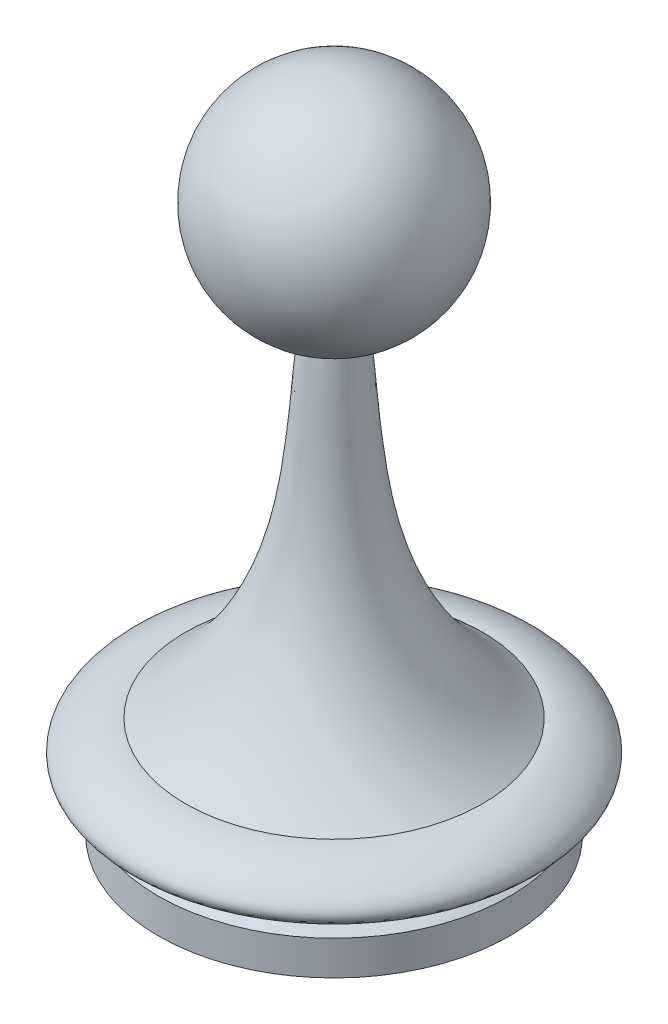
ISO-10303-21;
HEADER;
FILE_DESCRIPTION(('STEP AP214'),'2;1');
FILE_NAME('part.step','',(''),(''),'','','');
FILE_SCHEMA(('AUTOMOTIVE_DESIGN { 1 0 10303 214 1 1 1 1 }'));
ENDSEC;
DATA;
#1=APPLICATION_CONTEXT('core data for automotive mechanical design processes');
#2=APPLICATION_PROTOCOL_DEFINITION('international standard','automotive_design',2000,#1);
#3=PRODUCT_CONTEXT('',#1,'mechanical');
#4=PRODUCT('Part','Part','',(#3));
#5=PRODUCT_RELATED_PRODUCT_CATEGORY('part','',(#4));
#6=PRODUCT_DEFINITION_FORMATION('','',#4);
#7=PRODUCT_DEFINITION_CONTEXT('part definition',#1,'design');
#8=PRODUCT_DEFINITION('design','',#6,#7);
#9=PRODUCT_DEFINITION_SHAPE('','',#8);
#10=(LENGTH_UNIT() NAMED_UNIT(*) SI_UNIT(.MILLI.,.METRE.));
#11=(NAMED_UNIT(*) PLANE_ANGLE_UNIT() SI_UNIT($,.RADIAN.));
#12=(NAMED_UNIT(*) SI_UNIT($,.STERADIAN.) SOLID_ANGLE_UNIT());
#13=UNCERTAINTY_MEASURE_WITH_UNIT(LENGTH_MEASURE(1.E-05),#10,'distance_accuracy_value','');
#14=(GEOMETRIC_REPRESENTATION_CONTEXT(3) GLOBAL_UNCERTAINTY_ASSIGNED_CONTEXT((#13)) GLOBAL_UNIT_ASSIGNED_CONTEXT((#10,
#11,#12)) REPRESENTATION_CONTEXT('',''));
#15=CARTESIAN_POINT('',(0.,0.,0.));
#16=DIRECTION('',(0.,0.,1.));
#17=DIRECTION('',(1.,0.,0.));
#18=AXIS2_PLACEMENT_3D('',#15,#16,#17);
#19=CARTESIAN_POINT('',(0.,-0.321237182059704,0.));
#20=DIRECTION('',(0.,1.,0.));
#21=DIRECTION('',(1.,0.,0.));
#22=AXIS2_PLACEMENT_3D('',#19,#20,#21);
#23=SPHERICAL_SURFACE('',#22,0.321237182059704);
#24=CARTESIAN_POINT('',(0.,-0.633881308012907,0.));
#25=DIRECTION('',(0.,1.,0.));
#26=DIRECTION('',(0.,0.,1.));
#27=AXIS2_PLACEMENT_3D('',#24,#25,#26);
#28=CIRCLE('',#27,0.0738036424888207);
#29=CARTESIAN_POINT('',(0.,-0.633881308012907,0.0738036424888207));
#30=VERTEX_POINT('',#29);
#31=EDGE_CURVE('E56',#30,#30,#28,.T.);
#32=ORIENTED_EDGE('',*,*,#31,.T.);
#33=EDGE_LOOP('',(#32));
#34=FACE_BOUND('',#33,.T.);
#35=ADVANCED_FACE('F37',(#34),#23,.T.);
#36=CARTESIAN_POINT('',(0.,-1.91,0.));
#37=DIRECTION('',(0.,1.,0.));
#38=DIRECTION('',(0.,0.,1.));
#39=AXIS2_PLACEMENT_3D('',#36,#37,#38);
#40=PLANE('',#39);
#41=CARTESIAN_POINT('',(0.,-1.91,0.));
#42=DIRECTION('',(0.,1.,0.));
#43=DIRECTION('',(0.,0.,1.));
#44=AXIS2_PLACEMENT_3D('',#41,#42,#43);
#45=CIRCLE('',#44,0.51);
#46=CARTESIAN_POINT('',(0.,-1.91,0.51));
#47=VERTEX_POINT('',#46);
#48=EDGE_CURVE('E10',#47,#47,#45,.T.);
#49=ORIENTED_EDGE('',*,*,#48,.F.);
#50=EDGE_LOOP('',(#49));
#51=FACE_BOUND('',#50,.T.);
#52=ADVANCED_FACE('F84',(#51),#40,.F.);
#53=CARTESIAN_POINT('',(0.,0.,0.));
#54=DIRECTION('',(0.,1.,0.));
#55=DIRECTION('',(0.,0.,1.));
#56=AXIS2_PLACEMENT_3D('',#53,#54,#55);
#57=CYLINDRICAL_SURFACE('',#56,0.51);
#58=CARTESIAN_POINT('',(0.,-1.81,0.));
#59=DIRECTION('',(0.,1.,0.));
#60=DIRECTION('',(0.,0.,1.));
#61=AXIS2_PLACEMENT_3D('',#58,#59,#60);
#62=CIRCLE('',#61,0.51);
#63=CARTESIAN_POINT('',(0.,-1.81,0.51));
#64=VERTEX_POINT('',#63);
#65=EDGE_CURVE('E43',#64,#64,#62,.T.);
#66=ORIENTED_EDGE('',*,*,#65,.F.);
#67=EDGE_LOOP('',(#66));
#68=FACE_BOUND('',#67,.T.);
#69=ORIENTED_EDGE('',*,*,#48,.T.);
#70=EDGE_LOOP('',(#69));
#71=FACE_BOUND('',#70,.T.);
#72=ADVANCED_FACE('F81',(#68,#71),#57,.T.);
#73=CARTESIAN_POINT('',(0.,-1.81,0.));
#74=DIRECTION('',(0.,-1.,0.));
#75=DIRECTION('',(0.,0.,-1.));
#76=AXIS2_PLACEMENT_3D('',#73,#74,#75);
#77=CONICAL_SURFACE('',#76,0.51,1.0049564991341);
#78=CARTESIAN_POINT('',(0.,-1.76,0.));
#79=DIRECTION('',(0.,1.,0.));
#80=DIRECTION('',(0.,0.,1.));
#81=AXIS2_PLACEMENT_3D('',#78,#79,#80);
#82=CIRCLE('',#81,0.431274073544681);
#83=CARTESIAN_POINT('',(0.,-1.76,0.431274073544681));
#84=VERTEX_POINT('',#83);
#85=EDGE_CURVE('E47',#84,#84,#82,.T.);
#86=ORIENTED_EDGE('',*,*,#85,.F.);
#87=EDGE_LOOP('',(#86));
#88=FACE_BOUND('',#87,.T.);
#89=ORIENTED_EDGE('',*,*,#65,.T.);
#90=EDGE_LOOP('',(#89));
#91=FACE_BOUND('',#90,.T.);
#92=ADVANCED_FACE('F77',(#88,#91),#77,.T.);
#93=CARTESIAN_POINT('',(0.431274073544681,-1.76,0.));
#94=CARTESIAN_POINT('',(0.738755640249443,-1.7436110872615,0.));
#95=CARTESIAN_POINT('',(0.522126690308904,-1.6074813554475,0.));
#96=CARTESIAN_POINT('',(0.431274073544681,-1.61703220758244,0.));
#97=B_SPLINE_CURVE_WITH_KNOTS('',3,(#93,#94,#95,#96),.UNSPECIFIED.,.F.,.F.,(4,4),(0.,1.),.UNSPECIFIED.);
#98=CARTESIAN_POINT('',(0.,0.,0.));
#99=DIRECTION('',(0.,1.,0.));
#100=AXIS1_PLACEMENT('',#98,#99);
#101=SURFACE_OF_REVOLUTION('',#97,#100);
#102=CARTESIAN_POINT('',(0.,-1.61703220758244,0.));
#103=DIRECTION('',(0.,1.,0.));
#104=DIRECTION('',(0.,0.,1.));
#105=AXIS2_PLACEMENT_3D('',#102,#103,#104);
#106=CIRCLE('',#105,0.431274073544681);
#107=CARTESIAN_POINT('',(0.,-1.61703220758244,0.431274073544681));
#108=VERTEX_POINT('',#107);
#109=EDGE_CURVE('E51',#108,#108,#106,.T.);
#110=ORIENTED_EDGE('',*,*,#109,.F.);
#111=EDGE_LOOP('',(#110));
#112=FACE_BOUND('',#111,.T.);
#113=ORIENTED_EDGE('',*,*,#85,.T.);
#114=EDGE_LOOP('',(#113));
#115=FACE_BOUND('',#114,.T.);
#116=ADVANCED_FACE('F73',(#112,#115),#101,.T.);
#117=CARTESIAN_POINT('',(0.431274073544681,-1.61703220758244,0.));
#118=CARTESIAN_POINT('',(0.292451410150553,-1.51501054689749,0.));
#119=CARTESIAN_POINT('',(0.0977522717413116,-1.19002880403472,0.));
#120=CARTESIAN_POINT('',(0.0936250576661712,-0.821372263145632,0.));
#121=CARTESIAN_POINT('',(0.0738036424888207,-0.633881308012907,0.));
#122=B_SPLINE_CURVE_WITH_KNOTS('',3,(#117,#118,#119,#120,#121),.UNSPECIFIED.,.F.,.F.,(4,1,4),
(0.,0.472390604553208,1.),.UNSPECIFIED.);
#123=CARTESIAN_POINT('',(0.,0.,0.));
#124=DIRECTION('',(0.,1.,0.));
#125=AXIS1_PLACEMENT('',#123,#124);
#126=SURFACE_OF_REVOLUTION('',#122,#125);
#127=ORIENTED_EDGE('',*,*,#31,.F.);
#128=EDGE_LOOP('',(#127));
#129=FACE_BOUND('',#128,.T.);
#130=ORIENTED_EDGE('',*,*,#109,.T.);
#131=EDGE_LOOP('',(#130));
#132=FACE_BOUND('',#131,.T.);
#133=ADVANCED_FACE('F70',(#129,#132),#126,.T.);
#134=CLOSED_SHELL('',(#35,#52,#72,#92,#116,#133));
#135=MANIFOLD_SOLID_BREP('B2',#134);
#136=ADVANCED_BREP_SHAPE_REPRESENTATION('',(#18,#135),#14);
#137=SHAPE_DEFINITION_REPRESENTATION(#9,#136);
ENDSEC;
END-ISO-10303-21;
